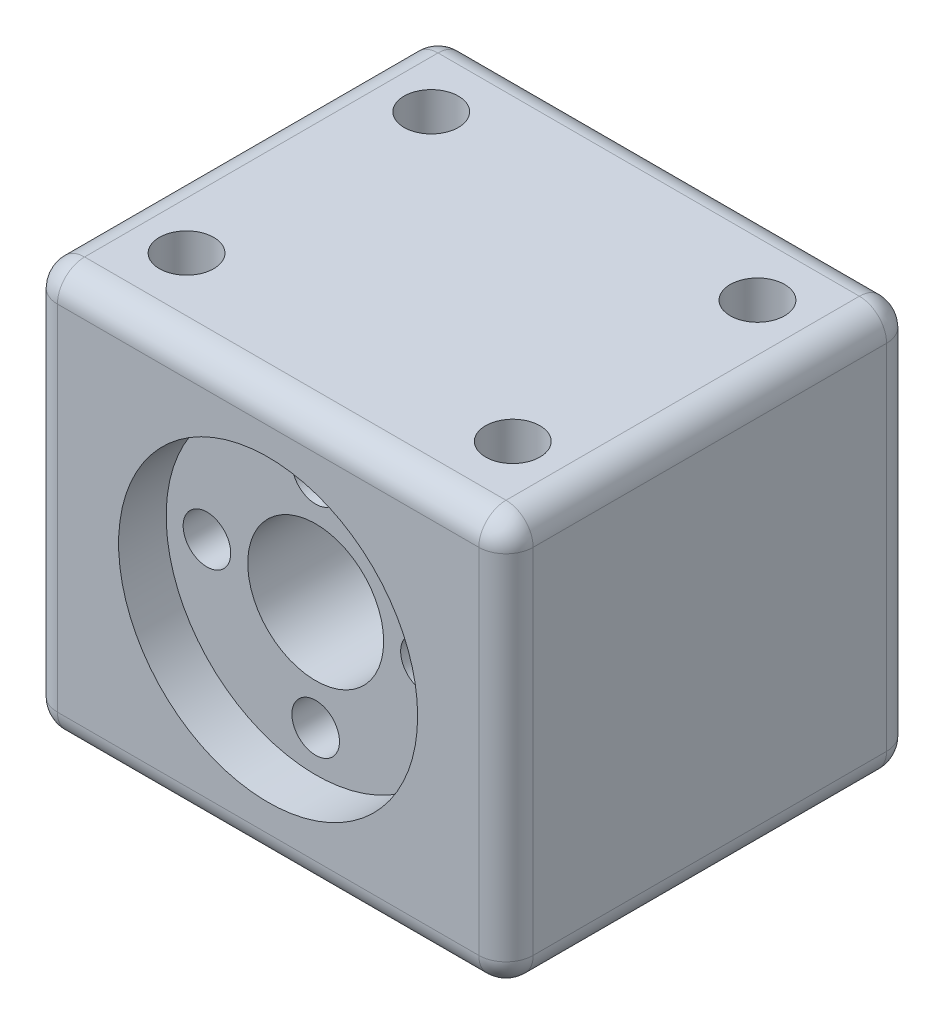
ISO-10303-21;
HEADER;
FILE_DESCRIPTION(('STEP AP214'),'2;1');
FILE_NAME('part.step','',(''),(''),'','','');
FILE_SCHEMA(('AUTOMOTIVE_DESIGN { 1 0 10303 214 1 1 1 1 }'));
ENDSEC;
DATA;
#1=APPLICATION_CONTEXT('core data for automotive mechanical design processes');
#2=APPLICATION_PROTOCOL_DEFINITION('international standard','automotive_design',2000,#1);
#3=PRODUCT_CONTEXT('',#1,'mechanical');
#4=PRODUCT('Part','Part','',(#3));
#5=PRODUCT_RELATED_PRODUCT_CATEGORY('part','',(#4));
#6=PRODUCT_DEFINITION_FORMATION('','',#4);
#7=PRODUCT_DEFINITION_CONTEXT('part definition',#1,'design');
#8=PRODUCT_DEFINITION('design','',#6,#7);
#9=PRODUCT_DEFINITION_SHAPE('','',#8);
#10=(LENGTH_UNIT() NAMED_UNIT(*) SI_UNIT(.MILLI.,.METRE.));
#11=(NAMED_UNIT(*) PLANE_ANGLE_UNIT() SI_UNIT($,.RADIAN.));
#12=(NAMED_UNIT(*) SI_UNIT($,.STERADIAN.) SOLID_ANGLE_UNIT());
#13=UNCERTAINTY_MEASURE_WITH_UNIT(LENGTH_MEASURE(1.E-05),#10,'distance_accuracy_value','');
#14=(GEOMETRIC_REPRESENTATION_CONTEXT(3) GLOBAL_UNCERTAINTY_ASSIGNED_CONTEXT((#13)) GLOBAL_UNIT_ASSIGNED_CONTEXT((#10,
#11,#12)) REPRESENTATION_CONTEXT('',''));
#15=CARTESIAN_POINT('',(0.,0.,0.));
#16=DIRECTION('',(0.,0.,1.));
#17=DIRECTION('',(1.,0.,0.));
#18=AXIS2_PLACEMENT_3D('',#15,#16,#17);
#19=CARTESIAN_POINT('',(0.,0.,30.));
#20=DIRECTION('',(0.,0.,-1.));
#21=DIRECTION('',(-1.,0.,0.));
#22=AXIS2_PLACEMENT_3D('',#19,#20,#21);
#23=CYLINDRICAL_SURFACE('',#22,5.);
#24=CARTESIAN_POINT('',(0.,0.,0.));
#25=DIRECTION('',(0.,0.,1.));
#26=DIRECTION('',(1.,0.,0.));
#27=AXIS2_PLACEMENT_3D('',#24,#25,#26);
#28=CIRCLE('',#27,5.);
#29=CARTESIAN_POINT('',(5.,0.,0.));
#30=VERTEX_POINT('',#29);
#31=EDGE_CURVE('E164',#30,#30,#28,.T.);
#32=ORIENTED_EDGE('',*,*,#31,.F.);
#33=EDGE_LOOP('',(#32));
#34=FACE_BOUND('',#33,.T.);
#35=CARTESIAN_POINT('',(0.,0.,26.5));
#36=DIRECTION('',(0.,0.,1.));
#37=DIRECTION('',(1.,0.,0.));
#38=AXIS2_PLACEMENT_3D('',#35,#36,#37);
#39=CIRCLE('',#38,5.);
#40=CARTESIAN_POINT('',(5.,0.,26.5));
#41=VERTEX_POINT('',#40);
#42=EDGE_CURVE('E303',#41,#41,#39,.T.);
#43=ORIENTED_EDGE('',*,*,#42,.T.);
#44=EDGE_LOOP('',(#43));
#45=FACE_BOUND('',#44,.T.);
#46=ADVANCED_FACE('F36',(#34,#45),#23,.F.);
#47=CARTESIAN_POINT('',(0.,8.,30.));
#48=DIRECTION('',(0.,0.,-1.));
#49=DIRECTION('',(-1.,0.,0.));
#50=AXIS2_PLACEMENT_3D('',#47,#48,#49);
#51=CYLINDRICAL_SURFACE('',#50,1.75);
#52=CARTESIAN_POINT('',(0.,8.,0.));
#53=DIRECTION('',(0.,0.,1.));
#54=DIRECTION('',(1.,0.,0.));
#55=AXIS2_PLACEMENT_3D('',#52,#53,#54);
#56=CIRCLE('',#55,1.75);
#57=CARTESIAN_POINT('',(1.75,8.,0.));
#58=VERTEX_POINT('',#57);
#59=EDGE_CURVE('E167',#58,#58,#56,.T.);
#60=ORIENTED_EDGE('',*,*,#59,.F.);
#61=EDGE_LOOP('',(#60));
#62=FACE_BOUND('',#61,.T.);
#63=CARTESIAN_POINT('',(0.,8.,26.5));
#64=DIRECTION('',(0.,0.,1.));
#65=DIRECTION('',(1.,0.,0.));
#66=AXIS2_PLACEMENT_3D('',#63,#64,#65);
#67=CIRCLE('',#66,1.75);
#68=CARTESIAN_POINT('',(1.75,8.,26.5));
#69=VERTEX_POINT('',#68);
#70=EDGE_CURVE('E300',#69,#69,#67,.T.);
#71=ORIENTED_EDGE('',*,*,#70,.T.);
#72=EDGE_LOOP('',(#71));
#73=FACE_BOUND('',#72,.T.);
#74=ADVANCED_FACE('F321',(#62,#73),#51,.F.);
#75=CARTESIAN_POINT('',(8.,0.,30.));
#76=DIRECTION('',(0.,0.,-1.));
#77=DIRECTION('',(-1.,0.,0.));
#78=AXIS2_PLACEMENT_3D('',#75,#76,#77);
#79=CYLINDRICAL_SURFACE('',#78,1.75);
#80=CARTESIAN_POINT('',(8.,0.,0.));
#81=DIRECTION('',(0.,0.,1.));
#82=DIRECTION('',(1.,0.,0.));
#83=AXIS2_PLACEMENT_3D('',#80,#81,#82);
#84=CIRCLE('',#83,1.75);
#85=CARTESIAN_POINT('',(9.75,0.,0.));
#86=VERTEX_POINT('',#85);
#87=EDGE_CURVE('E312',#86,#86,#84,.T.);
#88=ORIENTED_EDGE('',*,*,#87,.F.);
#89=EDGE_LOOP('',(#88));
#90=FACE_BOUND('',#89,.T.);
#91=CARTESIAN_POINT('',(8.,0.,26.5));
#92=DIRECTION('',(0.,0.,1.));
#93=DIRECTION('',(1.,0.,0.));
#94=AXIS2_PLACEMENT_3D('',#91,#92,#93);
#95=CIRCLE('',#94,1.75);
#96=CARTESIAN_POINT('',(9.75,0.,26.5));
#97=VERTEX_POINT('',#96);
#98=EDGE_CURVE('E297',#97,#97,#95,.T.);
#99=ORIENTED_EDGE('',*,*,#98,.T.);
#100=EDGE_LOOP('',(#99));
#101=FACE_BOUND('',#100,.T.);
#102=ADVANCED_FACE('F324',(#90,#101),#79,.F.);
#103=CARTESIAN_POINT('',(4.51808198568511E-13,-8.,30.));
#104=DIRECTION('',(0.,0.,-1.));
#105=DIRECTION('',(-1.,0.,0.));
#106=AXIS2_PLACEMENT_3D('',#103,#104,#105);
#107=CYLINDRICAL_SURFACE('',#106,1.75);
#108=CARTESIAN_POINT('',(4.51808198568511E-13,-8.,0.));
#109=DIRECTION('',(0.,0.,1.));
#110=DIRECTION('',(1.,0.,0.));
#111=AXIS2_PLACEMENT_3D('',#108,#109,#110);
#112=CIRCLE('',#111,1.75);
#113=CARTESIAN_POINT('',(1.75000000000045,-8.,0.));
#114=VERTEX_POINT('',#113);
#115=EDGE_CURVE('E309',#114,#114,#112,.T.);
#116=ORIENTED_EDGE('',*,*,#115,.F.);
#117=EDGE_LOOP('',(#116));
#118=FACE_BOUND('',#117,.T.);
#119=CARTESIAN_POINT('',(4.51808198568511E-13,-8.,26.5));
#120=DIRECTION('',(0.,0.,1.));
#121=DIRECTION('',(1.,0.,0.));
#122=AXIS2_PLACEMENT_3D('',#119,#120,#121);
#123=CIRCLE('',#122,1.75);
#124=CARTESIAN_POINT('',(1.75000000000045,-8.,26.5));
#125=VERTEX_POINT('',#124);
#126=EDGE_CURVE('E294',#125,#125,#123,.T.);
#127=ORIENTED_EDGE('',*,*,#126,.T.);
#128=EDGE_LOOP('',(#127));
#129=FACE_BOUND('',#128,.T.);
#130=ADVANCED_FACE('F360',(#118,#129),#107,.F.);
#131=CARTESIAN_POINT('',(-8.,0.,30.));
#132=DIRECTION('',(0.,0.,-1.));
#133=DIRECTION('',(-1.,0.,0.));
#134=AXIS2_PLACEMENT_3D('',#131,#132,#133);
#135=CYLINDRICAL_SURFACE('',#134,1.75);
#136=CARTESIAN_POINT('',(-8.,0.,0.));
#137=DIRECTION('',(0.,0.,1.));
#138=DIRECTION('',(1.,0.,0.));
#139=AXIS2_PLACEMENT_3D('',#136,#137,#138);
#140=CIRCLE('',#139,1.75);
#141=CARTESIAN_POINT('',(-6.25,0.,0.));
#142=VERTEX_POINT('',#141);
#143=EDGE_CURVE('E306',#142,#142,#140,.T.);
#144=ORIENTED_EDGE('',*,*,#143,.F.);
#145=EDGE_LOOP('',(#144));
#146=FACE_BOUND('',#145,.T.);
#147=CARTESIAN_POINT('',(-8.,0.,26.5));
#148=DIRECTION('',(0.,0.,1.));
#149=DIRECTION('',(1.,0.,0.));
#150=AXIS2_PLACEMENT_3D('',#147,#148,#149);
#151=CIRCLE('',#150,1.75);
#152=CARTESIAN_POINT('',(-6.25,0.,26.5));
#153=VERTEX_POINT('',#152);
#154=EDGE_CURVE('E170',#153,#153,#151,.T.);
#155=ORIENTED_EDGE('',*,*,#154,.T.);
#156=EDGE_LOOP('',(#155));
#157=FACE_BOUND('',#156,.T.);
#158=ADVANCED_FACE('F350',(#146,#157),#135,.F.);
#159=CARTESIAN_POINT('',(0.,0.,30.));
#160=DIRECTION('',(0.,0.,-1.));
#161=DIRECTION('',(-1.,0.,0.));
#162=AXIS2_PLACEMENT_3D('',#159,#160,#161);
#163=PLANE('',#162);
#164=DIRECTION('',(1.,0.,0.));
#165=VECTOR('',#164,1.);
#166=CARTESIAN_POINT('',(0.,-13.,30.));
#167=LINE('',#166,#165);
#168=CARTESIAN_POINT('',(-15.5,-13.,30.));
#169=VERTEX_POINT('',#168);
#170=CARTESIAN_POINT('',(15.5,-13.,30.));
#171=VERTEX_POINT('',#170);
#172=EDGE_CURVE('E146',#169,#171,#167,.T.);
#173=ORIENTED_EDGE('',*,*,#172,.T.);
#174=DIRECTION('',(0.,1.,0.));
#175=VECTOR('',#174,1.);
#176=CARTESIAN_POINT('',(15.5,0.,30.));
#177=LINE('',#176,#175);
#178=CARTESIAN_POINT('',(15.5,13.,30.));
#179=VERTEX_POINT('',#178);
#180=EDGE_CURVE('E206',#171,#179,#177,.T.);
#181=ORIENTED_EDGE('',*,*,#180,.T.);
#182=DIRECTION('',(-1.,0.,0.));
#183=VECTOR('',#182,1.);
#184=CARTESIAN_POINT('',(0.,13.,30.));
#185=LINE('',#184,#183);
#186=CARTESIAN_POINT('',(-15.5,13.,30.));
#187=VERTEX_POINT('',#186);
#188=EDGE_CURVE('E204',#179,#187,#185,.T.);
#189=ORIENTED_EDGE('',*,*,#188,.T.);
#190=DIRECTION('',(0.,-1.,0.));
#191=VECTOR('',#190,1.);
#192=CARTESIAN_POINT('',(-15.5,0.,30.));
#193=LINE('',#192,#191);
#194=EDGE_CURVE('E201',#187,#169,#193,.T.);
#195=ORIENTED_EDGE('',*,*,#194,.T.);
#196=EDGE_LOOP('',(#173,#181,#189,#195));
#197=FACE_BOUND('',#196,.T.);
#198=CARTESIAN_POINT('',(0.,0.,30.));
#199=DIRECTION('',(0.,0.,1.));
#200=DIRECTION('',(1.,0.,0.));
#201=AXIS2_PLACEMENT_3D('',#198,#199,#200);
#202=CIRCLE('',#201,11.);
#203=CARTESIAN_POINT('',(11.,0.,30.));
#204=VERTEX_POINT('',#203);
#205=EDGE_CURVE('E266',#204,#204,#202,.T.);
#206=ORIENTED_EDGE('',*,*,#205,.F.);
#207=EDGE_LOOP('',(#206));
#208=FACE_BOUND('',#207,.T.);
#209=ADVANCED_FACE('F348',(#197,#208),#163,.F.);
#210=CARTESIAN_POINT('',(0.,0.,0.));
#211=DIRECTION('',(0.,0.,-1.));
#212=DIRECTION('',(-1.,0.,0.));
#213=AXIS2_PLACEMENT_3D('',#210,#211,#212);
#214=PLANE('',#213);
#215=DIRECTION('',(0.,1.,0.));
#216=VECTOR('',#215,1.);
#217=CARTESIAN_POINT('',(15.5,-15.,0.));
#218=LINE('',#217,#216);
#219=CARTESIAN_POINT('',(15.5,13.,0.));
#220=VERTEX_POINT('',#219);
#221=CARTESIAN_POINT('',(15.5,-13.,0.));
#222=VERTEX_POINT('',#221);
#223=EDGE_CURVE('E178',#220,#222,#218,.F.);
#224=ORIENTED_EDGE('',*,*,#223,.T.);
#225=DIRECTION('',(1.,0.,0.));
#226=VECTOR('',#225,1.);
#227=CARTESIAN_POINT('',(-17.5,-13.,0.));
#228=LINE('',#227,#226);
#229=CARTESIAN_POINT('',(-15.5,-13.,0.));
#230=VERTEX_POINT('',#229);
#231=EDGE_CURVE('E180',#222,#230,#228,.F.);
#232=ORIENTED_EDGE('',*,*,#231,.T.);
#233=DIRECTION('',(0.,-1.,0.));
#234=VECTOR('',#233,1.);
#235=CARTESIAN_POINT('',(-15.5,15.,0.));
#236=LINE('',#235,#234);
#237=CARTESIAN_POINT('',(-15.5,13.,0.));
#238=VERTEX_POINT('',#237);
#239=EDGE_CURVE('E176',#230,#238,#236,.F.);
#240=ORIENTED_EDGE('',*,*,#239,.T.);
#241=DIRECTION('',(-1.,0.,0.));
#242=VECTOR('',#241,1.);
#243=CARTESIAN_POINT('',(17.5,13.,0.));
#244=LINE('',#243,#242);
#245=EDGE_CURVE('E174',#238,#220,#244,.F.);
#246=ORIENTED_EDGE('',*,*,#245,.T.);
#247=EDGE_LOOP('',(#224,#232,#240,#246));
#248=FACE_BOUND('',#247,.T.);
#249=ORIENTED_EDGE('',*,*,#115,.T.);
#250=EDGE_LOOP('',(#249));
#251=FACE_BOUND('',#250,.T.);
#252=ORIENTED_EDGE('',*,*,#59,.T.);
#253=EDGE_LOOP('',(#252));
#254=FACE_BOUND('',#253,.T.);
#255=ORIENTED_EDGE('',*,*,#31,.T.);
#256=EDGE_LOOP('',(#255));
#257=FACE_BOUND('',#256,.T.);
#258=ORIENTED_EDGE('',*,*,#87,.T.);
#259=EDGE_LOOP('',(#258));
#260=FACE_BOUND('',#259,.T.);
#261=ORIENTED_EDGE('',*,*,#143,.T.);
#262=EDGE_LOOP('',(#261));
#263=FACE_BOUND('',#262,.T.);
#264=ADVANCED_FACE('F318',(#248,#251,#254,#257,#260,#263),#214,.T.);
#265=CARTESIAN_POINT('',(17.5,-15.,30.));
#266=DIRECTION('',(-1.,0.,0.));
#267=DIRECTION('',(0.,0.,1.));
#268=AXIS2_PLACEMENT_3D('',#265,#266,#267);
#269=PLANE('',#268);
#270=DIRECTION('',(0.,1.,0.));
#271=VECTOR('',#270,1.);
#272=CARTESIAN_POINT('',(17.5,15.,2.));
#273=LINE('',#272,#271);
#274=CARTESIAN_POINT('',(17.5,-13.,2.));
#275=VERTEX_POINT('',#274);
#276=CARTESIAN_POINT('',(17.5,13.,2.));
#277=VERTEX_POINT('',#276);
#278=EDGE_CURVE('E187',#275,#277,#273,.T.);
#279=ORIENTED_EDGE('',*,*,#278,.T.);
#280=DIRECTION('',(0.,0.,-1.));
#281=VECTOR('',#280,1.);
#282=CARTESIAN_POINT('',(17.5,13.,30.));
#283=LINE('',#282,#281);
#284=CARTESIAN_POINT('',(17.5,13.,28.));
#285=VERTEX_POINT('',#284);
#286=EDGE_CURVE('E190',#277,#285,#283,.F.);
#287=ORIENTED_EDGE('',*,*,#286,.T.);
#288=DIRECTION('',(0.,1.,0.));
#289=VECTOR('',#288,1.);
#290=CARTESIAN_POINT('',(17.5,-15.,28.));
#291=LINE('',#290,#289);
#292=CARTESIAN_POINT('',(17.5,-13.,28.));
#293=VERTEX_POINT('',#292);
#294=EDGE_CURVE('E185',#285,#293,#291,.F.);
#295=ORIENTED_EDGE('',*,*,#294,.T.);
#296=DIRECTION('',(0.,0.,-1.));
#297=VECTOR('',#296,1.);
#298=CARTESIAN_POINT('',(17.5,-13.,30.));
#299=LINE('',#298,#297);
#300=EDGE_CURVE('E183',#293,#275,#299,.T.);
#301=ORIENTED_EDGE('',*,*,#300,.T.);
#302=EDGE_LOOP('',(#279,#287,#295,#301));
#303=FACE_BOUND('',#302,.T.);
#304=ADVANCED_FACE('F357',(#303),#269,.F.);
#305=CARTESIAN_POINT('',(-17.5,15.,30.));
#306=DIRECTION('',(0.,-1.,0.));
#307=DIRECTION('',(0.,0.,-1.));
#308=AXIS2_PLACEMENT_3D('',#305,#306,#307);
#309=PLANE('',#308);
#310=CARTESIAN_POINT('',(12.,15.,24.));
#311=DIRECTION('',(0.,-1.,0.));
#312=DIRECTION('',(0.,0.,-1.));
#313=AXIS2_PLACEMENT_3D('',#310,#311,#312);
#314=CIRCLE('',#313,2.);
#315=CARTESIAN_POINT('',(12.,15.,22.));
#316=VERTEX_POINT('',#315);
#317=EDGE_CURVE('E217',#316,#316,#314,.F.);
#318=ORIENTED_EDGE('',*,*,#317,.F.);
#319=EDGE_LOOP('',(#318));
#320=FACE_BOUND('',#319,.T.);
#321=CARTESIAN_POINT('',(-12.,15.,6.));
#322=DIRECTION('',(0.,-1.,0.));
#323=DIRECTION('',(0.,0.,-1.));
#324=AXIS2_PLACEMENT_3D('',#321,#322,#323);
#325=CIRCLE('',#324,2.);
#326=CARTESIAN_POINT('',(-12.,15.,4.));
#327=VERTEX_POINT('',#326);
#328=EDGE_CURVE('E276',#327,#327,#325,.F.);
#329=ORIENTED_EDGE('',*,*,#328,.F.);
#330=EDGE_LOOP('',(#329));
#331=FACE_BOUND('',#330,.T.);
#332=CARTESIAN_POINT('',(12.,15.,6.));
#333=DIRECTION('',(0.,-1.,0.));
#334=DIRECTION('',(0.,0.,-1.));
#335=AXIS2_PLACEMENT_3D('',#332,#333,#334);
#336=CIRCLE('',#335,2.);
#337=CARTESIAN_POINT('',(12.,15.,4.));
#338=VERTEX_POINT('',#337);
#339=EDGE_CURVE('E273',#338,#338,#336,.F.);
#340=ORIENTED_EDGE('',*,*,#339,.F.);
#341=EDGE_LOOP('',(#340));
#342=FACE_BOUND('',#341,.T.);
#343=CARTESIAN_POINT('',(-12.,15.,24.));
#344=DIRECTION('',(0.,-1.,0.));
#345=DIRECTION('',(0.,0.,-1.));
#346=AXIS2_PLACEMENT_3D('',#343,#344,#345);
#347=CIRCLE('',#346,2.);
#348=CARTESIAN_POINT('',(-12.,15.,22.));
#349=VERTEX_POINT('',#348);
#350=EDGE_CURVE('E270',#349,#349,#347,.F.);
#351=ORIENTED_EDGE('',*,*,#350,.F.);
#352=EDGE_LOOP('',(#351));
#353=FACE_BOUND('',#352,.T.);
#354=DIRECTION('',(-1.,0.,0.));
#355=VECTOR('',#354,1.);
#356=CARTESIAN_POINT('',(-17.5,15.,2.));
#357=LINE('',#356,#355);
#358=CARTESIAN_POINT('',(15.5,15.,2.));
#359=VERTEX_POINT('',#358);
#360=CARTESIAN_POINT('',(-15.5,15.,2.));
#361=VERTEX_POINT('',#360);
#362=EDGE_CURVE('E45',#359,#361,#357,.T.);
#363=ORIENTED_EDGE('',*,*,#362,.T.);
#364=DIRECTION('',(0.,0.,-1.));
#365=VECTOR('',#364,1.);
#366=CARTESIAN_POINT('',(-15.5,15.,30.));
#367=LINE('',#366,#365);
#368=CARTESIAN_POINT('',(-15.5,15.,28.));
#369=VERTEX_POINT('',#368);
#370=EDGE_CURVE('E11',#361,#369,#367,.F.);
#371=ORIENTED_EDGE('',*,*,#370,.T.);
#372=DIRECTION('',(-1.,0.,0.));
#373=VECTOR('',#372,1.);
#374=CARTESIAN_POINT('',(-17.5,15.,28.));
#375=LINE('',#374,#373);
#376=CARTESIAN_POINT('',(15.5,15.,28.));
#377=VERTEX_POINT('',#376);
#378=EDGE_CURVE('E211',#369,#377,#375,.F.);
#379=ORIENTED_EDGE('',*,*,#378,.T.);
#380=DIRECTION('',(0.,0.,-1.));
#381=VECTOR('',#380,1.);
#382=CARTESIAN_POINT('',(15.5,15.,30.));
#383=LINE('',#382,#381);
#384=EDGE_CURVE('E209',#377,#359,#383,.T.);
#385=ORIENTED_EDGE('',*,*,#384,.T.);
#386=EDGE_LOOP('',(#363,#371,#379,#385));
#387=FACE_BOUND('',#386,.T.);
#388=ADVANCED_FACE('F406',(#320,#331,#342,#353,#387),#309,.F.);
#389=CARTESIAN_POINT('',(-17.5,-15.,30.));
#390=DIRECTION('',(1.,0.,0.));
#391=DIRECTION('',(0.,0.,-1.));
#392=AXIS2_PLACEMENT_3D('',#389,#390,#391);
#393=PLANE('',#392);
#394=DIRECTION('',(0.,-1.,0.));
#395=VECTOR('',#394,1.);
#396=CARTESIAN_POINT('',(-17.5,-15.,28.));
#397=LINE('',#396,#395);
#398=CARTESIAN_POINT('',(-17.5,-13.,28.));
#399=VERTEX_POINT('',#398);
#400=CARTESIAN_POINT('',(-17.5,13.,28.));
#401=VERTEX_POINT('',#400);
#402=EDGE_CURVE('E194',#399,#401,#397,.F.);
#403=ORIENTED_EDGE('',*,*,#402,.T.);
#404=DIRECTION('',(0.,0.,-1.));
#405=VECTOR('',#404,1.);
#406=CARTESIAN_POINT('',(-17.5,13.,30.));
#407=LINE('',#406,#405);
#408=CARTESIAN_POINT('',(-17.5,13.,2.));
#409=VERTEX_POINT('',#408);
#410=EDGE_CURVE('E199',#401,#409,#407,.T.);
#411=ORIENTED_EDGE('',*,*,#410,.T.);
#412=DIRECTION('',(0.,-1.,0.));
#413=VECTOR('',#412,1.);
#414=CARTESIAN_POINT('',(-17.5,-15.,2.));
#415=LINE('',#414,#413);
#416=CARTESIAN_POINT('',(-17.5,-13.,2.));
#417=VERTEX_POINT('',#416);
#418=EDGE_CURVE('E196',#409,#417,#415,.T.);
#419=ORIENTED_EDGE('',*,*,#418,.T.);
#420=DIRECTION('',(0.,0.,-1.));
#421=VECTOR('',#420,1.);
#422=CARTESIAN_POINT('',(-17.5,-13.,30.));
#423=LINE('',#422,#421);
#424=EDGE_CURVE('E192',#417,#399,#423,.F.);
#425=ORIENTED_EDGE('',*,*,#424,.T.);
#426=EDGE_LOOP('',(#403,#411,#419,#425));
#427=FACE_BOUND('',#426,.T.);
#428=ADVANCED_FACE('F398',(#427),#393,.F.);
#429=CARTESIAN_POINT('',(-17.5,-15.,30.));
#430=DIRECTION('',(0.,1.,0.));
#431=DIRECTION('',(0.,0.,1.));
#432=AXIS2_PLACEMENT_3D('',#429,#430,#431);
#433=PLANE('',#432);
#434=CARTESIAN_POINT('',(12.,-15.,24.));
#435=DIRECTION('',(0.,1.,0.));
#436=DIRECTION('',(0.,0.,1.));
#437=AXIS2_PLACEMENT_3D('',#434,#435,#436);
#438=CIRCLE('',#437,2.);
#439=CARTESIAN_POINT('',(12.,-15.,26.));
#440=VERTEX_POINT('',#439);
#441=EDGE_CURVE('E40',#440,#440,#438,.F.);
#442=ORIENTED_EDGE('',*,*,#441,.F.);
#443=EDGE_LOOP('',(#442));
#444=FACE_BOUND('',#443,.T.);
#445=CARTESIAN_POINT('',(-12.,-15.,6.));
#446=DIRECTION('',(0.,1.,0.));
#447=DIRECTION('',(0.,0.,1.));
#448=AXIS2_PLACEMENT_3D('',#445,#446,#447);
#449=CIRCLE('',#448,2.);
#450=CARTESIAN_POINT('',(-12.,-15.,8.));
#451=VERTEX_POINT('',#450);
#452=EDGE_CURVE('E274',#451,#451,#449,.F.);
#453=ORIENTED_EDGE('',*,*,#452,.F.);
#454=EDGE_LOOP('',(#453));
#455=FACE_BOUND('',#454,.T.);
#456=CARTESIAN_POINT('',(12.,-15.,6.));
#457=DIRECTION('',(0.,1.,0.));
#458=DIRECTION('',(0.,0.,1.));
#459=AXIS2_PLACEMENT_3D('',#456,#457,#458);
#460=CIRCLE('',#459,2.);
#461=CARTESIAN_POINT('',(12.,-15.,8.));
#462=VERTEX_POINT('',#461);
#463=EDGE_CURVE('E271',#462,#462,#460,.F.);
#464=ORIENTED_EDGE('',*,*,#463,.F.);
#465=EDGE_LOOP('',(#464));
#466=FACE_BOUND('',#465,.T.);
#467=CARTESIAN_POINT('',(-12.,-15.,24.));
#468=DIRECTION('',(0.,1.,0.));
#469=DIRECTION('',(0.,0.,1.));
#470=AXIS2_PLACEMENT_3D('',#467,#468,#469);
#471=CIRCLE('',#470,2.);
#472=CARTESIAN_POINT('',(-12.,-15.,26.));
#473=VERTEX_POINT('',#472);
#474=EDGE_CURVE('E267',#473,#473,#471,.F.);
#475=ORIENTED_EDGE('',*,*,#474,.F.);
#476=EDGE_LOOP('',(#475));
#477=FACE_BOUND('',#476,.T.);
#478=DIRECTION('',(1.,0.,0.));
#479=VECTOR('',#478,1.);
#480=CARTESIAN_POINT('',(17.5,-15.,2.));
#481=LINE('',#480,#479);
#482=CARTESIAN_POINT('',(-15.5,-15.,2.));
#483=VERTEX_POINT('',#482);
#484=CARTESIAN_POINT('',(15.5,-15.,2.));
#485=VERTEX_POINT('',#484);
#486=EDGE_CURVE('E139',#483,#485,#481,.T.);
#487=ORIENTED_EDGE('',*,*,#486,.T.);
#488=DIRECTION('',(0.,0.,-1.));
#489=VECTOR('',#488,1.);
#490=CARTESIAN_POINT('',(15.5,-15.,30.));
#491=LINE('',#490,#489);
#492=CARTESIAN_POINT('',(15.5,-15.,28.));
#493=VERTEX_POINT('',#492);
#494=EDGE_CURVE('E135',#485,#493,#491,.F.);
#495=ORIENTED_EDGE('',*,*,#494,.T.);
#496=DIRECTION('',(1.,0.,0.));
#497=VECTOR('',#496,1.);
#498=CARTESIAN_POINT('',(-17.5,-15.,28.));
#499=LINE('',#498,#497);
#500=CARTESIAN_POINT('',(-15.5,-15.,28.));
#501=VERTEX_POINT('',#500);
#502=EDGE_CURVE('E127',#493,#501,#499,.F.);
#503=ORIENTED_EDGE('',*,*,#502,.T.);
#504=DIRECTION('',(0.,0.,-1.));
#505=VECTOR('',#504,1.);
#506=CARTESIAN_POINT('',(-15.5,-15.,30.));
#507=LINE('',#506,#505);
#508=EDGE_CURVE('E132',#501,#483,#507,.T.);
#509=ORIENTED_EDGE('',*,*,#508,.T.);
#510=EDGE_LOOP('',(#487,#495,#503,#509));
#511=FACE_BOUND('',#510,.T.);
#512=ADVANCED_FACE('F130',(#444,#455,#466,#477,#511),#433,.F.);
#513=CARTESIAN_POINT('',(0.,0.,26.5));
#514=DIRECTION('',(0.,0.,1.));
#515=DIRECTION('',(1.,0.,0.));
#516=AXIS2_PLACEMENT_3D('',#513,#514,#515);
#517=CYLINDRICAL_SURFACE('',#516,11.);
#518=CARTESIAN_POINT('',(0.,0.,26.5));
#519=DIRECTION('',(0.,0.,1.));
#520=DIRECTION('',(1.,0.,0.));
#521=AXIS2_PLACEMENT_3D('',#518,#519,#520);
#522=CIRCLE('',#521,11.);
#523=CARTESIAN_POINT('',(11.,0.,26.5));
#524=VERTEX_POINT('',#523);
#525=EDGE_CURVE('E289',#524,#524,#522,.T.);
#526=ORIENTED_EDGE('',*,*,#525,.F.);
#527=EDGE_LOOP('',(#526));
#528=FACE_BOUND('',#527,.T.);
#529=ORIENTED_EDGE('',*,*,#205,.T.);
#530=EDGE_LOOP('',(#529));
#531=FACE_BOUND('',#530,.T.);
#532=ADVANCED_FACE('F331',(#528,#531),#517,.F.);
#533=CARTESIAN_POINT('',(0.,0.,26.5));
#534=DIRECTION('',(0.,0.,1.));
#535=DIRECTION('',(1.,0.,0.));
#536=AXIS2_PLACEMENT_3D('',#533,#534,#535);
#537=PLANE('',#536);
#538=ORIENTED_EDGE('',*,*,#42,.F.);
#539=EDGE_LOOP('',(#538));
#540=FACE_BOUND('',#539,.T.);
#541=ORIENTED_EDGE('',*,*,#70,.F.);
#542=EDGE_LOOP('',(#541));
#543=FACE_BOUND('',#542,.T.);
#544=ORIENTED_EDGE('',*,*,#98,.F.);
#545=EDGE_LOOP('',(#544));
#546=FACE_BOUND('',#545,.T.);
#547=ORIENTED_EDGE('',*,*,#126,.F.);
#548=EDGE_LOOP('',(#547));
#549=FACE_BOUND('',#548,.T.);
#550=ORIENTED_EDGE('',*,*,#154,.F.);
#551=EDGE_LOOP('',(#550));
#552=FACE_BOUND('',#551,.T.);
#553=ORIENTED_EDGE('',*,*,#525,.T.);
#554=EDGE_LOOP('',(#553));
#555=FACE_BOUND('',#554,.T.);
#556=ADVANCED_FACE('F328',(#540,#543,#546,#549,#552,#555),#537,.T.);
#557=CARTESIAN_POINT('',(0.,13.,28.));
#558=DIRECTION('',(-1.,0.,0.));
#559=DIRECTION('',(0.,0.,1.));
#560=AXIS2_PLACEMENT_3D('',#557,#558,#559);
#561=CYLINDRICAL_SURFACE('',#560,2.);
#562=CARTESIAN_POINT('',(-15.5,13.,28.));
#563=DIRECTION('',(-1.,0.,0.));
#564=DIRECTION('',(0.,0.,1.));
#565=AXIS2_PLACEMENT_3D('',#562,#563,#564);
#566=CIRCLE('',#565,2.);
#567=EDGE_CURVE('E263',#187,#369,#566,.T.);
#568=ORIENTED_EDGE('',*,*,#567,.F.);
#569=ORIENTED_EDGE('',*,*,#188,.F.);
#570=CARTESIAN_POINT('',(15.5,13.,28.));
#571=DIRECTION('',(1.,0.,0.));
#572=DIRECTION('',(0.,0.,-1.));
#573=AXIS2_PLACEMENT_3D('',#570,#571,#572);
#574=CIRCLE('',#573,2.);
#575=EDGE_CURVE('E260',#377,#179,#574,.T.);
#576=ORIENTED_EDGE('',*,*,#575,.F.);
#577=ORIENTED_EDGE('',*,*,#378,.F.);
#578=EDGE_LOOP('',(#568,#569,#576,#577));
#579=FACE_BOUND('',#578,.T.);
#580=ADVANCED_FACE('F38',(#579),#561,.T.);
#581=CARTESIAN_POINT('',(-15.5,13.,28.));
#582=DIRECTION('',(0.,1.,0.));
#583=DIRECTION('',(0.,0.,1.));
#584=AXIS2_PLACEMENT_3D('',#581,#582,#583);
#585=SPHERICAL_SURFACE('',#584,2.);
#586=CARTESIAN_POINT('',(-15.5,13.,28.));
#587=DIRECTION('',(0.,1.,0.));
#588=DIRECTION('',(0.,0.,1.));
#589=AXIS2_PLACEMENT_3D('',#586,#587,#588);
#590=CIRCLE('',#589,2.);
#591=EDGE_CURVE('E254',#187,#401,#590,.F.);
#592=ORIENTED_EDGE('',*,*,#591,.F.);
#593=ORIENTED_EDGE('',*,*,#567,.T.);
#594=CARTESIAN_POINT('',(-15.5,13.,28.));
#595=DIRECTION('',(0.,0.,1.));
#596=DIRECTION('',(1.,0.,0.));
#597=AXIS2_PLACEMENT_3D('',#594,#595,#596);
#598=CIRCLE('',#597,2.);
#599=EDGE_CURVE('E257',#401,#369,#598,.F.);
#600=ORIENTED_EDGE('',*,*,#599,.F.);
#601=EDGE_LOOP('',(#592,#593,#600));
#602=FACE_BOUND('',#601,.T.);
#603=ADVANCED_FACE('F444',(#602),#585,.T.);
#604=CARTESIAN_POINT('',(15.5,13.,28.));
#605=DIRECTION('',(0.,0.,1.));
#606=DIRECTION('',(1.,0.,0.));
#607=AXIS2_PLACEMENT_3D('',#604,#605,#606);
#608=SPHERICAL_SURFACE('',#607,2.);
#609=CARTESIAN_POINT('',(15.5,13.,28.));
#610=DIRECTION('',(0.,0.,1.));
#611=DIRECTION('',(1.,0.,0.));
#612=AXIS2_PLACEMENT_3D('',#609,#610,#611);
#613=CIRCLE('',#612,2.);
#614=EDGE_CURVE('E249',#377,#285,#613,.F.);
#615=ORIENTED_EDGE('',*,*,#614,.F.);
#616=ORIENTED_EDGE('',*,*,#575,.T.);
#617=CARTESIAN_POINT('',(15.5,13.,28.));
#618=DIRECTION('',(0.,1.,0.));
#619=DIRECTION('',(0.,0.,1.));
#620=AXIS2_PLACEMENT_3D('',#617,#618,#619);
#621=CIRCLE('',#620,2.);
#622=EDGE_CURVE('E252',#285,#179,#621,.F.);
#623=ORIENTED_EDGE('',*,*,#622,.F.);
#624=EDGE_LOOP('',(#615,#616,#623));
#625=FACE_BOUND('',#624,.T.);
#626=ADVANCED_FACE('F453',(#625),#608,.T.);
#627=CARTESIAN_POINT('',(-15.5,13.,30.));
#628=DIRECTION('',(0.,0.,-1.));
#629=DIRECTION('',(-1.,0.,0.));
#630=AXIS2_PLACEMENT_3D('',#627,#628,#629);
#631=CYLINDRICAL_SURFACE('',#630,2.);
#632=ORIENTED_EDGE('',*,*,#599,.T.);
#633=ORIENTED_EDGE('',*,*,#370,.F.);
#634=CARTESIAN_POINT('',(-15.5,13.,2.));
#635=DIRECTION('',(0.,0.,-1.));
#636=DIRECTION('',(-1.,0.,0.));
#637=AXIS2_PLACEMENT_3D('',#634,#635,#636);
#638=CIRCLE('',#637,2.);
#639=EDGE_CURVE('E53',#409,#361,#638,.T.);
#640=ORIENTED_EDGE('',*,*,#639,.F.);
#641=ORIENTED_EDGE('',*,*,#410,.F.);
#642=EDGE_LOOP('',(#632,#633,#640,#641));
#643=FACE_BOUND('',#642,.T.);
#644=ADVANCED_FACE('F440',(#643),#631,.T.);
#645=CARTESIAN_POINT('',(-15.5,0.,28.));
#646=DIRECTION('',(0.,-1.,0.));
#647=DIRECTION('',(0.,0.,-1.));
#648=AXIS2_PLACEMENT_3D('',#645,#646,#647);
#649=CYLINDRICAL_SURFACE('',#648,2.);
#650=ORIENTED_EDGE('',*,*,#591,.T.);
#651=ORIENTED_EDGE('',*,*,#402,.F.);
#652=CARTESIAN_POINT('',(-15.5,-13.,28.));
#653=DIRECTION('',(0.,-1.,0.));
#654=DIRECTION('',(0.,0.,-1.));
#655=AXIS2_PLACEMENT_3D('',#652,#653,#654);
#656=CIRCLE('',#655,2.);
#657=EDGE_CURVE('E150',#169,#399,#656,.T.);
#658=ORIENTED_EDGE('',*,*,#657,.F.);
#659=ORIENTED_EDGE('',*,*,#194,.F.);
#660=EDGE_LOOP('',(#650,#651,#658,#659));
#661=FACE_BOUND('',#660,.T.);
#662=ADVANCED_FACE('F506',(#661),#649,.T.);
#663=CARTESIAN_POINT('',(0.,-13.,28.));
#664=DIRECTION('',(1.,0.,0.));
#665=DIRECTION('',(0.,0.,-1.));
#666=AXIS2_PLACEMENT_3D('',#663,#664,#665);
#667=CYLINDRICAL_SURFACE('',#666,2.);
#668=CARTESIAN_POINT('',(15.5,-13.,28.));
#669=DIRECTION('',(1.,0.,0.));
#670=DIRECTION('',(0.,0.,-1.));
#671=AXIS2_PLACEMENT_3D('',#668,#669,#670);
#672=CIRCLE('',#671,2.);
#673=EDGE_CURVE('E151',#171,#493,#672,.T.);
#674=ORIENTED_EDGE('',*,*,#673,.F.);
#675=ORIENTED_EDGE('',*,*,#172,.F.);
#676=CARTESIAN_POINT('',(-15.5,-13.,28.));
#677=DIRECTION('',(-1.,0.,0.));
#678=DIRECTION('',(0.,0.,1.));
#679=AXIS2_PLACEMENT_3D('',#676,#677,#678);
#680=CIRCLE('',#679,2.);
#681=EDGE_CURVE('E143',#501,#169,#680,.T.);
#682=ORIENTED_EDGE('',*,*,#681,.F.);
#683=ORIENTED_EDGE('',*,*,#502,.F.);
#684=EDGE_LOOP('',(#674,#675,#682,#683));
#685=FACE_BOUND('',#684,.T.);
#686=ADVANCED_FACE('F145',(#685),#667,.T.);
#687=CARTESIAN_POINT('',(15.5,0.,28.));
#688=DIRECTION('',(0.,1.,0.));
#689=DIRECTION('',(0.,0.,1.));
#690=AXIS2_PLACEMENT_3D('',#687,#688,#689);
#691=CYLINDRICAL_SURFACE('',#690,2.);
#692=ORIENTED_EDGE('',*,*,#622,.T.);
#693=ORIENTED_EDGE('',*,*,#180,.F.);
#694=CARTESIAN_POINT('',(15.5,-13.,28.));
#695=DIRECTION('',(0.,-1.,0.));
#696=DIRECTION('',(0.,0.,-1.));
#697=AXIS2_PLACEMENT_3D('',#694,#695,#696);
#698=CIRCLE('',#697,2.);
#699=EDGE_CURVE('E241',#293,#171,#698,.T.);
#700=ORIENTED_EDGE('',*,*,#699,.F.);
#701=ORIENTED_EDGE('',*,*,#294,.F.);
#702=EDGE_LOOP('',(#692,#693,#700,#701));
#703=FACE_BOUND('',#702,.T.);
#704=ADVANCED_FACE('F458',(#703),#691,.T.);
#705=CARTESIAN_POINT('',(15.5,13.,30.));
#706=DIRECTION('',(0.,0.,-1.));
#707=DIRECTION('',(-1.,0.,0.));
#708=AXIS2_PLACEMENT_3D('',#705,#706,#707);
#709=CYLINDRICAL_SURFACE('',#708,2.);
#710=ORIENTED_EDGE('',*,*,#614,.T.);
#711=ORIENTED_EDGE('',*,*,#286,.F.);
#712=CARTESIAN_POINT('',(15.5,13.,2.));
#713=DIRECTION('',(0.,0.,-1.));
#714=DIRECTION('',(-1.,0.,0.));
#715=AXIS2_PLACEMENT_3D('',#712,#713,#714);
#716=CIRCLE('',#715,2.);
#717=EDGE_CURVE('E238',#359,#277,#716,.T.);
#718=ORIENTED_EDGE('',*,*,#717,.F.);
#719=ORIENTED_EDGE('',*,*,#384,.F.);
#720=EDGE_LOOP('',(#710,#711,#718,#719));
#721=FACE_BOUND('',#720,.T.);
#722=ADVANCED_FACE('F420',(#721),#709,.T.);
#723=CARTESIAN_POINT('',(-17.5,13.,2.));
#724=DIRECTION('',(1.,0.,0.));
#725=DIRECTION('',(0.,0.,-1.));
#726=AXIS2_PLACEMENT_3D('',#723,#724,#725);
#727=CYLINDRICAL_SURFACE('',#726,2.);
#728=CARTESIAN_POINT('',(-15.5,13.,2.));
#729=DIRECTION('',(-1.,0.,0.));
#730=DIRECTION('',(0.,0.,1.));
#731=AXIS2_PLACEMENT_3D('',#728,#729,#730);
#732=CIRCLE('',#731,2.);
#733=EDGE_CURVE('E247',#361,#238,#732,.T.);
#734=ORIENTED_EDGE('',*,*,#733,.F.);
#735=ORIENTED_EDGE('',*,*,#362,.F.);
#736=CARTESIAN_POINT('',(15.5,13.,2.));
#737=DIRECTION('',(1.,0.,0.));
#738=DIRECTION('',(0.,1.,0.));
#739=AXIS2_PLACEMENT_3D('',#736,#737,#738);
#740=CIRCLE('',#739,2.);
#741=EDGE_CURVE('E235',#220,#359,#740,.T.);
#742=ORIENTED_EDGE('',*,*,#741,.F.);
#743=ORIENTED_EDGE('',*,*,#245,.F.);
#744=EDGE_LOOP('',(#734,#735,#742,#743));
#745=FACE_BOUND('',#744,.T.);
#746=ADVANCED_FACE('F415',(#745),#727,.T.);
#747=CARTESIAN_POINT('',(-15.5,13.,2.));
#748=DIRECTION('',(0.,1.,0.));
#749=DIRECTION('',(0.,0.,1.));
#750=AXIS2_PLACEMENT_3D('',#747,#748,#749);
#751=SPHERICAL_SURFACE('',#750,2.);
#752=ORIENTED_EDGE('',*,*,#639,.T.);
#753=ORIENTED_EDGE('',*,*,#733,.T.);
#754=CARTESIAN_POINT('',(-15.5,13.,2.));
#755=DIRECTION('',(0.,1.,0.));
#756=DIRECTION('',(-1.,0.,0.));
#757=AXIS2_PLACEMENT_3D('',#754,#755,#756);
#758=CIRCLE('',#757,2.);
#759=EDGE_CURVE('E158',#409,#238,#758,.F.);
#760=ORIENTED_EDGE('',*,*,#759,.F.);
#761=EDGE_LOOP('',(#752,#753,#760));
#762=FACE_BOUND('',#761,.T.);
#763=ADVANCED_FACE('F431',(#762),#751,.T.);
#764=CARTESIAN_POINT('',(-15.5,-13.,28.));
#765=DIRECTION('',(0.,0.,1.));
#766=DIRECTION('',(1.,0.,0.));
#767=AXIS2_PLACEMENT_3D('',#764,#765,#766);
#768=SPHERICAL_SURFACE('',#767,2.);
#769=ORIENTED_EDGE('',*,*,#681,.T.);
#770=ORIENTED_EDGE('',*,*,#657,.T.);
#771=CARTESIAN_POINT('',(-15.5,-13.,28.));
#772=DIRECTION('',(0.,0.,1.));
#773=DIRECTION('',(1.,0.,0.));
#774=AXIS2_PLACEMENT_3D('',#771,#772,#773);
#775=CIRCLE('',#774,2.);
#776=EDGE_CURVE('E154',#501,#399,#775,.F.);
#777=ORIENTED_EDGE('',*,*,#776,.F.);
#778=EDGE_LOOP('',(#769,#770,#777));
#779=FACE_BOUND('',#778,.T.);
#780=ADVANCED_FACE('F155',(#779),#768,.T.);
#781=CARTESIAN_POINT('',(15.5,-13.,28.));
#782=DIRECTION('',(0.,0.,1.));
#783=DIRECTION('',(1.,0.,0.));
#784=AXIS2_PLACEMENT_3D('',#781,#782,#783);
#785=SPHERICAL_SURFACE('',#784,2.);
#786=ORIENTED_EDGE('',*,*,#699,.T.);
#787=ORIENTED_EDGE('',*,*,#673,.T.);
#788=CARTESIAN_POINT('',(15.5,-13.,28.));
#789=DIRECTION('',(0.,0.,1.));
#790=DIRECTION('',(1.,0.,0.));
#791=AXIS2_PLACEMENT_3D('',#788,#789,#790);
#792=CIRCLE('',#791,2.);
#793=EDGE_CURVE('E159',#293,#493,#792,.F.);
#794=ORIENTED_EDGE('',*,*,#793,.F.);
#795=EDGE_LOOP('',(#786,#787,#794));
#796=FACE_BOUND('',#795,.T.);
#797=ADVANCED_FACE('F490',(#796),#785,.T.);
#798=CARTESIAN_POINT('',(15.5,13.,2.));
#799=DIRECTION('',(0.,1.,0.));
#800=DIRECTION('',(0.,0.,1.));
#801=AXIS2_PLACEMENT_3D('',#798,#799,#800);
#802=SPHERICAL_SURFACE('',#801,2.);
#803=ORIENTED_EDGE('',*,*,#741,.T.);
#804=ORIENTED_EDGE('',*,*,#717,.T.);
#805=CARTESIAN_POINT('',(15.5,13.,2.));
#806=DIRECTION('',(0.,1.,0.));
#807=DIRECTION('',(0.,0.,1.));
#808=AXIS2_PLACEMENT_3D('',#805,#806,#807);
#809=CIRCLE('',#808,2.);
#810=EDGE_CURVE('E229',#220,#277,#809,.F.);
#811=ORIENTED_EDGE('',*,*,#810,.F.);
#812=EDGE_LOOP('',(#803,#804,#811));
#813=FACE_BOUND('',#812,.T.);
#814=ADVANCED_FACE('F422',(#813),#802,.T.);
#815=CARTESIAN_POINT('',(-15.5,-15.,2.));
#816=DIRECTION('',(0.,1.,0.));
#817=DIRECTION('',(0.,0.,1.));
#818=AXIS2_PLACEMENT_3D('',#815,#816,#817);
#819=CYLINDRICAL_SURFACE('',#818,2.);
#820=ORIENTED_EDGE('',*,*,#759,.T.);
#821=ORIENTED_EDGE('',*,*,#239,.F.);
#822=CARTESIAN_POINT('',(-15.5,-13.,2.));
#823=DIRECTION('',(0.,-1.,0.));
#824=DIRECTION('',(0.,0.,-1.));
#825=AXIS2_PLACEMENT_3D('',#822,#823,#824);
#826=CIRCLE('',#825,2.);
#827=EDGE_CURVE('E226',#417,#230,#826,.T.);
#828=ORIENTED_EDGE('',*,*,#827,.F.);
#829=ORIENTED_EDGE('',*,*,#418,.F.);
#830=EDGE_LOOP('',(#820,#821,#828,#829));
#831=FACE_BOUND('',#830,.T.);
#832=ADVANCED_FACE('F434',(#831),#819,.T.);
#833=CARTESIAN_POINT('',(-15.5,-13.,30.));
#834=DIRECTION('',(0.,0.,-1.));
#835=DIRECTION('',(-1.,0.,0.));
#836=AXIS2_PLACEMENT_3D('',#833,#834,#835);
#837=CYLINDRICAL_SURFACE('',#836,2.);
#838=ORIENTED_EDGE('',*,*,#776,.T.);
#839=ORIENTED_EDGE('',*,*,#424,.F.);
#840=CARTESIAN_POINT('',(-15.5,-13.,2.));
#841=DIRECTION('',(0.,0.,-1.));
#842=DIRECTION('',(-1.,0.,0.));
#843=AXIS2_PLACEMENT_3D('',#840,#841,#842);
#844=CIRCLE('',#843,2.);
#845=EDGE_CURVE('E162',#483,#417,#844,.T.);
#846=ORIENTED_EDGE('',*,*,#845,.F.);
#847=ORIENTED_EDGE('',*,*,#508,.F.);
#848=EDGE_LOOP('',(#838,#839,#846,#847));
#849=FACE_BOUND('',#848,.T.);
#850=ADVANCED_FACE('F161',(#849),#837,.T.);
#851=CARTESIAN_POINT('',(15.5,-13.,30.));
#852=DIRECTION('',(0.,0.,-1.));
#853=DIRECTION('',(-1.,0.,0.));
#854=AXIS2_PLACEMENT_3D('',#851,#852,#853);
#855=CYLINDRICAL_SURFACE('',#854,2.);
#856=ORIENTED_EDGE('',*,*,#793,.T.);
#857=ORIENTED_EDGE('',*,*,#494,.F.);
#858=CARTESIAN_POINT('',(15.5,-13.,2.));
#859=DIRECTION('',(0.,0.,-1.));
#860=DIRECTION('',(-1.,0.,0.));
#861=AXIS2_PLACEMENT_3D('',#858,#859,#860);
#862=CIRCLE('',#861,2.);
#863=EDGE_CURVE('E222',#275,#485,#862,.T.);
#864=ORIENTED_EDGE('',*,*,#863,.F.);
#865=ORIENTED_EDGE('',*,*,#300,.F.);
#866=EDGE_LOOP('',(#856,#857,#864,#865));
#867=FACE_BOUND('',#866,.T.);
#868=ADVANCED_FACE('F464',(#867),#855,.T.);
#869=CARTESIAN_POINT('',(15.5,-15.,2.));
#870=DIRECTION('',(0.,-1.,0.));
#871=DIRECTION('',(0.,0.,-1.));
#872=AXIS2_PLACEMENT_3D('',#869,#870,#871);
#873=CYLINDRICAL_SURFACE('',#872,2.);
#874=ORIENTED_EDGE('',*,*,#810,.T.);
#875=ORIENTED_EDGE('',*,*,#278,.F.);
#876=CARTESIAN_POINT('',(15.5,-13.,2.));
#877=DIRECTION('',(0.,-1.,0.));
#878=DIRECTION('',(0.,0.,-1.));
#879=AXIS2_PLACEMENT_3D('',#876,#877,#878);
#880=CIRCLE('',#879,2.);
#881=EDGE_CURVE('E219',#222,#275,#880,.T.);
#882=ORIENTED_EDGE('',*,*,#881,.F.);
#883=ORIENTED_EDGE('',*,*,#223,.F.);
#884=EDGE_LOOP('',(#874,#875,#882,#883));
#885=FACE_BOUND('',#884,.T.);
#886=ADVANCED_FACE('F427',(#885),#873,.T.);
#887=CARTESIAN_POINT('',(-15.5,-13.,2.));
#888=DIRECTION('',(-1.,0.,0.));
#889=DIRECTION('',(0.,0.,1.));
#890=AXIS2_PLACEMENT_3D('',#887,#888,#889);
#891=SPHERICAL_SURFACE('',#890,2.);
#892=ORIENTED_EDGE('',*,*,#845,.T.);
#893=ORIENTED_EDGE('',*,*,#827,.T.);
#894=CARTESIAN_POINT('',(-15.5,-13.,2.));
#895=DIRECTION('',(-1.,0.,0.));
#896=DIRECTION('',(0.,0.,1.));
#897=AXIS2_PLACEMENT_3D('',#894,#895,#896);
#898=CIRCLE('',#897,2.);
#899=EDGE_CURVE('E216',#483,#230,#898,.F.);
#900=ORIENTED_EDGE('',*,*,#899,.F.);
#901=EDGE_LOOP('',(#892,#893,#900));
#902=FACE_BOUND('',#901,.T.);
#903=ADVANCED_FACE('F471',(#902),#891,.T.);
#904=CARTESIAN_POINT('',(15.5,-13.,2.));
#905=DIRECTION('',(1.,0.,0.));
#906=DIRECTION('',(0.,0.,-1.));
#907=AXIS2_PLACEMENT_3D('',#904,#905,#906);
#908=SPHERICAL_SURFACE('',#907,2.);
#909=ORIENTED_EDGE('',*,*,#881,.T.);
#910=ORIENTED_EDGE('',*,*,#863,.T.);
#911=CARTESIAN_POINT('',(15.5,-13.,2.));
#912=DIRECTION('',(1.,0.,0.));
#913=DIRECTION('',(0.,0.,-1.));
#914=AXIS2_PLACEMENT_3D('',#911,#912,#913);
#915=CIRCLE('',#914,2.);
#916=EDGE_CURVE('E214',#222,#485,#915,.F.);
#917=ORIENTED_EDGE('',*,*,#916,.F.);
#918=EDGE_LOOP('',(#909,#910,#917));
#919=FACE_BOUND('',#918,.T.);
#920=ADVANCED_FACE('F467',(#919),#908,.T.);
#921=CARTESIAN_POINT('',(-17.5,-13.,2.));
#922=DIRECTION('',(-1.,0.,0.));
#923=DIRECTION('',(0.,0.,1.));
#924=AXIS2_PLACEMENT_3D('',#921,#922,#923);
#925=CYLINDRICAL_SURFACE('',#924,2.);
#926=ORIENTED_EDGE('',*,*,#899,.T.);
#927=ORIENTED_EDGE('',*,*,#231,.F.);
#928=ORIENTED_EDGE('',*,*,#916,.T.);
#929=ORIENTED_EDGE('',*,*,#486,.F.);
#930=EDGE_LOOP('',(#926,#927,#928,#929));
#931=FACE_BOUND('',#930,.T.);
#932=ADVANCED_FACE('F381',(#931),#925,.T.);
#933=CARTESIAN_POINT('',(-12.,25.,24.));
#934=DIRECTION('',(0.,-1.,0.));
#935=DIRECTION('',(0.,0.,-1.));
#936=AXIS2_PLACEMENT_3D('',#933,#934,#935);
#937=CYLINDRICAL_SURFACE('',#936,2.);
#938=ORIENTED_EDGE('',*,*,#474,.T.);
#939=EDGE_LOOP('',(#938));
#940=FACE_BOUND('',#939,.T.);
#941=ORIENTED_EDGE('',*,*,#350,.T.);
#942=EDGE_LOOP('',(#941));
#943=FACE_BOUND('',#942,.T.);
#944=ADVANCED_FACE('F377',(#940,#943),#937,.F.);
#945=CARTESIAN_POINT('',(12.,25.,6.));
#946=DIRECTION('',(0.,-1.,0.));
#947=DIRECTION('',(0.,0.,-1.));
#948=AXIS2_PLACEMENT_3D('',#945,#946,#947);
#949=CYLINDRICAL_SURFACE('',#948,2.);
#950=ORIENTED_EDGE('',*,*,#463,.T.);
#951=EDGE_LOOP('',(#950));
#952=FACE_BOUND('',#951,.T.);
#953=ORIENTED_EDGE('',*,*,#339,.T.);
#954=EDGE_LOOP('',(#953));
#955=FACE_BOUND('',#954,.T.);
#956=ADVANCED_FACE('F380',(#952,#955),#949,.F.);
#957=CARTESIAN_POINT('',(-12.,25.,6.));
#958=DIRECTION('',(0.,-1.,0.));
#959=DIRECTION('',(0.,0.,-1.));
#960=AXIS2_PLACEMENT_3D('',#957,#958,#959);
#961=CYLINDRICAL_SURFACE('',#960,2.);
#962=ORIENTED_EDGE('',*,*,#452,.T.);
#963=EDGE_LOOP('',(#962));
#964=FACE_BOUND('',#963,.T.);
#965=ORIENTED_EDGE('',*,*,#328,.T.);
#966=EDGE_LOOP('',(#965));
#967=FACE_BOUND('',#966,.T.);
#968=ADVANCED_FACE('F383',(#964,#967),#961,.F.);
#969=CARTESIAN_POINT('',(12.,25.,24.));
#970=DIRECTION('',(0.,-1.,0.));
#971=DIRECTION('',(0.,0.,-1.));
#972=AXIS2_PLACEMENT_3D('',#969,#970,#971);
#973=CYLINDRICAL_SURFACE('',#972,2.);
#974=ORIENTED_EDGE('',*,*,#441,.T.);
#975=EDGE_LOOP('',(#974));
#976=FACE_BOUND('',#975,.T.);
#977=ORIENTED_EDGE('',*,*,#317,.T.);
#978=EDGE_LOOP('',(#977));
#979=FACE_BOUND('',#978,.T.);
#980=ADVANCED_FACE('F386',(#976,#979),#973,.F.);
#981=CLOSED_SHELL('',(#46,#74,#102,#130,#158,#209,#264,#304,#388,#428,#512,#532,#556,#580,#603,
#626,#644,#662,#686,#704,#722,#746,#763,#780,#797,#814,#832,#850,#868,#886,#903,#920,#932,#944,
#956,#968,#980));
#982=MANIFOLD_SOLID_BREP('B2',#981);
#983=ADVANCED_BREP_SHAPE_REPRESENTATION('',(#18,#982),#14);
#984=SHAPE_DEFINITION_REPRESENTATION(#9,#983);
ENDSEC;
END-ISO-10303-21;
